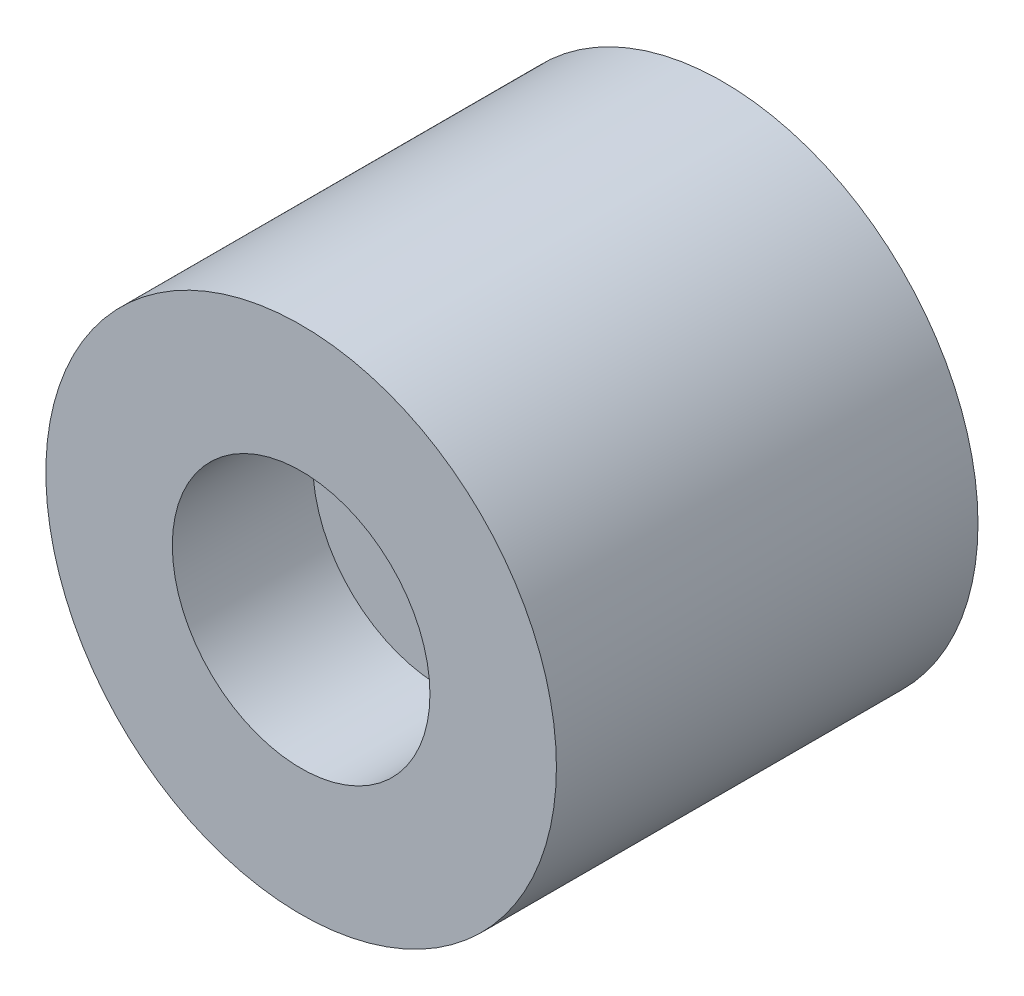
ISO-10303-21;
HEADER;
FILE_DESCRIPTION(('STEP AP214'),'2;1');
FILE_NAME('part.step','',(''),(''),'','','');
FILE_SCHEMA(('AUTOMOTIVE_DESIGN { 1 0 10303 214 1 1 1 1 }'));
ENDSEC;
DATA;
#1=APPLICATION_CONTEXT('core data for automotive mechanical design processes');
#2=APPLICATION_PROTOCOL_DEFINITION('international standard','automotive_design',2000,#1);
#3=PRODUCT_CONTEXT('',#1,'mechanical');
#4=PRODUCT('Part','Part','',(#3));
#5=PRODUCT_RELATED_PRODUCT_CATEGORY('part','',(#4));
#6=PRODUCT_DEFINITION_FORMATION('','',#4);
#7=PRODUCT_DEFINITION_CONTEXT('part definition',#1,'design');
#8=PRODUCT_DEFINITION('design','',#6,#7);
#9=PRODUCT_DEFINITION_SHAPE('','',#8);
#10=(LENGTH_UNIT() NAMED_UNIT(*) SI_UNIT(.MILLI.,.METRE.));
#11=(NAMED_UNIT(*) PLANE_ANGLE_UNIT() SI_UNIT($,.RADIAN.));
#12=(NAMED_UNIT(*) SI_UNIT($,.STERADIAN.) SOLID_ANGLE_UNIT());
#13=UNCERTAINTY_MEASURE_WITH_UNIT(LENGTH_MEASURE(1.E-05),#10,'distance_accuracy_value','');
#14=(GEOMETRIC_REPRESENTATION_CONTEXT(3) GLOBAL_UNCERTAINTY_ASSIGNED_CONTEXT((#13)) GLOBAL_UNIT_ASSIGNED_CONTEXT((#10,
#11,#12)) REPRESENTATION_CONTEXT('',''));
#15=CARTESIAN_POINT('',(0.,0.,0.));
#16=DIRECTION('',(0.,0.,1.));
#17=DIRECTION('',(1.,0.,0.));
#18=AXIS2_PLACEMENT_3D('',#15,#16,#17);
#19=CARTESIAN_POINT('',(0.,0.,9.));
#20=DIRECTION('',(0.,0.,-1.));
#21=DIRECTION('',(-1.,0.,0.));
#22=AXIS2_PLACEMENT_3D('',#19,#20,#21);
#23=CYLINDRICAL_SURFACE('',#22,5.45);
#24=CARTESIAN_POINT('',(0.,0.,9.));
#25=DIRECTION('',(0.,0.,1.));
#26=DIRECTION('',(1.,0.,0.));
#27=AXIS2_PLACEMENT_3D('',#24,#25,#26);
#28=CIRCLE('',#27,5.45);
#29=CARTESIAN_POINT('',(5.45,0.,9.));
#30=VERTEX_POINT('',#29);
#31=EDGE_CURVE('E10',#30,#30,#28,.T.);
#32=ORIENTED_EDGE('',*,*,#31,.F.);
#33=EDGE_LOOP('',(#32));
#34=FACE_BOUND('',#33,.T.);
#35=CARTESIAN_POINT('',(0.,0.,0.));
#36=DIRECTION('',(0.,0.,1.));
#37=DIRECTION('',(1.,0.,0.));
#38=AXIS2_PLACEMENT_3D('',#35,#36,#37);
#39=CIRCLE('',#38,5.45);
#40=CARTESIAN_POINT('',(5.45,0.,0.));
#41=VERTEX_POINT('',#40);
#42=EDGE_CURVE('E39',#41,#41,#39,.T.);
#43=ORIENTED_EDGE('',*,*,#42,.T.);
#44=EDGE_LOOP('',(#43));
#45=FACE_BOUND('',#44,.T.);
#46=ADVANCED_FACE('F36',(#34,#45),#23,.T.);
#47=CARTESIAN_POINT('',(0.,0.,9.));
#48=DIRECTION('',(0.,0.,1.));
#49=DIRECTION('',(1.,0.,0.));
#50=AXIS2_PLACEMENT_3D('',#47,#48,#49);
#51=PLANE('',#50);
#52=CARTESIAN_POINT('',(0.,0.,9.));
#53=DIRECTION('',(0.,0.,1.));
#54=DIRECTION('',(1.,0.,0.));
#55=AXIS2_PLACEMENT_3D('',#52,#53,#54);
#56=CIRCLE('',#55,2.75);
#57=CARTESIAN_POINT('',(2.75,0.,9.));
#58=VERTEX_POINT('',#57);
#59=EDGE_CURVE('E50',#58,#58,#56,.T.);
#60=ORIENTED_EDGE('',*,*,#59,.F.);
#61=EDGE_LOOP('',(#60));
#62=FACE_BOUND('',#61,.T.);
#63=ORIENTED_EDGE('',*,*,#31,.T.);
#64=EDGE_LOOP('',(#63));
#65=FACE_BOUND('',#64,.T.);
#66=ADVANCED_FACE('F67',(#62,#65),#51,.T.);
#67=CARTESIAN_POINT('',(0.,0.,0.));
#68=DIRECTION('',(0.,0.,1.));
#69=DIRECTION('',(1.,0.,0.));
#70=AXIS2_PLACEMENT_3D('',#67,#68,#69);
#71=PLANE('',#70);
#72=ORIENTED_EDGE('',*,*,#42,.F.);
#73=EDGE_LOOP('',(#72));
#74=FACE_BOUND('',#73,.T.);
#75=ADVANCED_FACE('F63',(#74),#71,.F.);
#76=CARTESIAN_POINT('',(0.,0.,6.));
#77=DIRECTION('',(0.,0.,1.));
#78=DIRECTION('',(1.,0.,0.));
#79=AXIS2_PLACEMENT_3D('',#76,#77,#78);
#80=CYLINDRICAL_SURFACE('',#79,2.75);
#81=CARTESIAN_POINT('',(0.,0.,6.));
#82=DIRECTION('',(0.,0.,1.));
#83=DIRECTION('',(1.,0.,0.));
#84=AXIS2_PLACEMENT_3D('',#81,#82,#83);
#85=CIRCLE('',#84,2.75);
#86=CARTESIAN_POINT('',(2.75,0.,6.));
#87=VERTEX_POINT('',#86);
#88=EDGE_CURVE('E48',#87,#87,#85,.T.);
#89=ORIENTED_EDGE('',*,*,#88,.F.);
#90=EDGE_LOOP('',(#89));
#91=FACE_BOUND('',#90,.T.);
#92=ORIENTED_EDGE('',*,*,#59,.T.);
#93=EDGE_LOOP('',(#92));
#94=FACE_BOUND('',#93,.T.);
#95=ADVANCED_FACE('F60',(#91,#94),#80,.F.);
#96=CARTESIAN_POINT('',(0.,0.,6.));
#97=DIRECTION('',(0.,0.,1.));
#98=DIRECTION('',(1.,0.,0.));
#99=AXIS2_PLACEMENT_3D('',#96,#97,#98);
#100=PLANE('',#99);
#101=ORIENTED_EDGE('',*,*,#88,.T.);
#102=EDGE_LOOP('',(#101));
#103=FACE_BOUND('',#102,.T.);
#104=ADVANCED_FACE('F58',(#103),#100,.T.);
#105=CLOSED_SHELL('',(#46,#66,#75,#95,#104));
#106=MANIFOLD_SOLID_BREP('B2',#105);
#107=ADVANCED_BREP_SHAPE_REPRESENTATION('',(#18,#106),#14);
#108=SHAPE_DEFINITION_REPRESENTATION(#9,#107);
ENDSEC;
END-ISO-10303-21;
